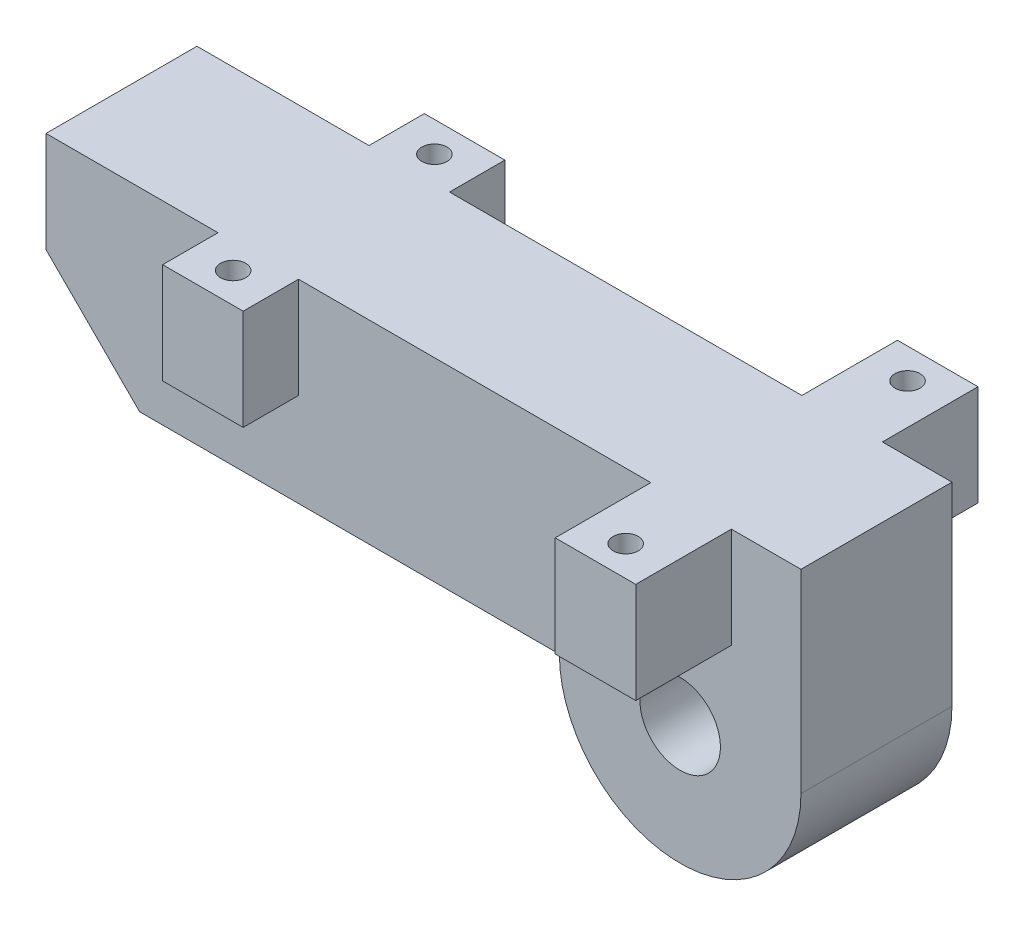
ISO-10303-21;
HEADER;
FILE_DESCRIPTION(('STEP AP214'),'2;1');
FILE_NAME('part.step','',(''),(''),'','','');
FILE_SCHEMA(('AUTOMOTIVE_DESIGN { 1 0 10303 214 1 1 1 1 }'));
ENDSEC;
DATA;
#1=APPLICATION_CONTEXT('core data for automotive mechanical design processes');
#2=APPLICATION_PROTOCOL_DEFINITION('international standard','automotive_design',2000,#1);
#3=PRODUCT_CONTEXT('',#1,'mechanical');
#4=PRODUCT('Part','Part','',(#3));
#5=PRODUCT_RELATED_PRODUCT_CATEGORY('part','',(#4));
#6=PRODUCT_DEFINITION_FORMATION('','',#4);
#7=PRODUCT_DEFINITION_CONTEXT('part definition',#1,'design');
#8=PRODUCT_DEFINITION('design','',#6,#7);
#9=PRODUCT_DEFINITION_SHAPE('','',#8);
#10=(LENGTH_UNIT() NAMED_UNIT(*) SI_UNIT(.MILLI.,.METRE.));
#11=(NAMED_UNIT(*) PLANE_ANGLE_UNIT() SI_UNIT($,.RADIAN.));
#12=(NAMED_UNIT(*) SI_UNIT($,.STERADIAN.) SOLID_ANGLE_UNIT());
#13=UNCERTAINTY_MEASURE_WITH_UNIT(LENGTH_MEASURE(1.E-05),#10,'distance_accuracy_value','');
#14=(GEOMETRIC_REPRESENTATION_CONTEXT(3) GLOBAL_UNCERTAINTY_ASSIGNED_CONTEXT((#13)) GLOBAL_UNIT_ASSIGNED_CONTEXT((#10,
#11,#12)) REPRESENTATION_CONTEXT('',''));
#15=CARTESIAN_POINT('',(0.,0.,0.));
#16=DIRECTION('',(0.,0.,1.));
#17=DIRECTION('',(1.,0.,0.));
#18=AXIS2_PLACEMENT_3D('',#15,#16,#17);
#19=CARTESIAN_POINT('',(0.,0.,0.));
#20=DIRECTION('',(0.,1.,0.));
#21=DIRECTION('',(0.,0.,1.));
#22=AXIS2_PLACEMENT_3D('',#19,#20,#21);
#23=PLANE('',#22);
#24=CARTESIAN_POINT('',(-16.4121202909197,0.,-10.));
#25=DIRECTION('',(0.,1.,0.));
#26=DIRECTION('',(0.,0.,1.));
#27=AXIS2_PLACEMENT_3D('',#24,#25,#26);
#28=CIRCLE('',#27,1.25);
#29=CARTESIAN_POINT('',(-16.4121202909197,0.,-8.75));
#30=VERTEX_POINT('',#29);
#31=EDGE_CURVE('E294',#30,#30,#28,.T.);
#32=ORIENTED_EDGE('',*,*,#31,.T.);
#33=EDGE_LOOP('',(#32));
#34=FACE_BOUND('',#33,.T.);
#35=DIRECTION('',(1.,0.,0.));
#36=VECTOR('',#35,1.);
#37=CARTESIAN_POINT('',(-37.5,0.,-7.50000000000002));
#38=LINE('',#37,#36);
#39=CARTESIAN_POINT('',(-20.4121202909197,0.,-7.50000000000002));
#40=VERTEX_POINT('',#39);
#41=CARTESIAN_POINT('',(-12.4121202909197,0.,-7.50000000000002));
#42=VERTEX_POINT('',#41);
#43=EDGE_CURVE('E11',#40,#42,#38,.T.);
#44=ORIENTED_EDGE('',*,*,#43,.F.);
#45=DIRECTION('',(0.,0.,1.));
#46=VECTOR('',#45,1.);
#47=CARTESIAN_POINT('',(-20.4121202909197,0.,-13.));
#48=LINE('',#47,#46);
#49=CARTESIAN_POINT('',(-20.4121202909197,0.,-13.));
#50=VERTEX_POINT('',#49);
#51=EDGE_CURVE('E174',#50,#40,#48,.T.);
#52=ORIENTED_EDGE('',*,*,#51,.F.);
#53=DIRECTION('',(-1.,0.,0.));
#54=VECTOR('',#53,1.);
#55=CARTESIAN_POINT('',(-20.4121202909197,0.,-13.));
#56=LINE('',#55,#54);
#57=CARTESIAN_POINT('',(-12.4121202909197,0.,-13.));
#58=VERTEX_POINT('',#57);
#59=EDGE_CURVE('E98',#58,#50,#56,.T.);
#60=ORIENTED_EDGE('',*,*,#59,.F.);
#61=DIRECTION('',(0.,0.,-1.));
#62=VECTOR('',#61,1.);
#63=CARTESIAN_POINT('',(-12.4121202909197,0.,-13.));
#64=LINE('',#63,#62);
#65=EDGE_CURVE('E91',#42,#58,#64,.T.);
#66=ORIENTED_EDGE('',*,*,#65,.F.);
#67=EDGE_LOOP('',(#44,#52,#60,#66));
#68=FACE_BOUND('',#67,.T.);
#69=ADVANCED_FACE('F39',(#34,#68),#23,.F.);
#70=CARTESIAN_POINT('',(26.5878797090803,0.,-14.));
#71=DIRECTION('',(0.,1.,0.));
#72=DIRECTION('',(0.,0.,1.));
#73=AXIS2_PLACEMENT_3D('',#70,#71,#72);
#74=CIRCLE('',#73,1.25);
#75=CARTESIAN_POINT('',(26.5878797090803,0.,-12.75));
#76=VERTEX_POINT('',#75);
#77=EDGE_CURVE('E306',#76,#76,#74,.T.);
#78=ORIENTED_EDGE('',*,*,#77,.T.);
#79=EDGE_LOOP('',(#78));
#80=FACE_BOUND('',#79,.T.);
#81=CARTESIAN_POINT('',(22.5878797090803,0.,-7.50000000000001));
#82=VERTEX_POINT('',#81);
#83=CARTESIAN_POINT('',(30.5878797090803,0.,-7.50000000000001));
#84=VERTEX_POINT('',#83);
#85=EDGE_CURVE('E49',#82,#84,#38,.T.);
#86=ORIENTED_EDGE('',*,*,#85,.F.);
#87=DIRECTION('',(0.,0.,1.));
#88=VECTOR('',#87,1.);
#89=CARTESIAN_POINT('',(22.5878797090803,0.,-17.));
#90=LINE('',#89,#88);
#91=CARTESIAN_POINT('',(22.5878797090803,0.,-17.));
#92=VERTEX_POINT('',#91);
#93=EDGE_CURVE('E207',#92,#82,#90,.T.);
#94=ORIENTED_EDGE('',*,*,#93,.F.);
#95=DIRECTION('',(-1.,0.,0.));
#96=VECTOR('',#95,1.);
#97=CARTESIAN_POINT('',(22.5878797090803,0.,-17.));
#98=LINE('',#97,#96);
#99=CARTESIAN_POINT('',(30.5878797090803,0.,-17.));
#100=VERTEX_POINT('',#99);
#101=EDGE_CURVE('E205',#100,#92,#98,.T.);
#102=ORIENTED_EDGE('',*,*,#101,.F.);
#103=DIRECTION('',(0.,0.,-1.));
#104=VECTOR('',#103,1.);
#105=CARTESIAN_POINT('',(30.5878797090803,0.,-17.));
#106=LINE('',#105,#104);
#107=EDGE_CURVE('E203',#84,#100,#106,.T.);
#108=ORIENTED_EDGE('',*,*,#107,.F.);
#109=EDGE_LOOP('',(#86,#94,#102,#108));
#110=FACE_BOUND('',#109,.T.);
#111=ADVANCED_FACE('F388',(#80,#110),#23,.F.);
#112=CARTESIAN_POINT('',(26.5878797090803,0.,14.));
#113=DIRECTION('',(0.,1.,0.));
#114=DIRECTION('',(0.,0.,1.));
#115=AXIS2_PLACEMENT_3D('',#112,#113,#114);
#116=CIRCLE('',#115,1.25);
#117=CARTESIAN_POINT('',(26.5878797090803,0.,15.25));
#118=VERTEX_POINT('',#117);
#119=EDGE_CURVE('E191',#118,#118,#116,.T.);
#120=ORIENTED_EDGE('',*,*,#119,.T.);
#121=EDGE_LOOP('',(#120));
#122=FACE_BOUND('',#121,.T.);
#123=DIRECTION('',(-1.,0.,0.));
#124=VECTOR('',#123,1.);
#125=CARTESIAN_POINT('',(-37.5,0.,7.49999999999997));
#126=LINE('',#125,#124);
#127=CARTESIAN_POINT('',(30.5878797090803,0.,7.49999999999997));
#128=VERTEX_POINT('',#127);
#129=CARTESIAN_POINT('',(22.5878797090803,0.,7.49999999999997));
#130=VERTEX_POINT('',#129);
#131=EDGE_CURVE('E267',#128,#130,#126,.T.);
#132=ORIENTED_EDGE('',*,*,#131,.F.);
#133=DIRECTION('',(0.,0.,-1.));
#134=VECTOR('',#133,1.);
#135=CARTESIAN_POINT('',(30.5878797090803,0.,7.49999999999999));
#136=LINE('',#135,#134);
#137=CARTESIAN_POINT('',(30.5878797090803,0.,17.));
#138=VERTEX_POINT('',#137);
#139=EDGE_CURVE('E200',#138,#128,#136,.T.);
#140=ORIENTED_EDGE('',*,*,#139,.F.);
#141=DIRECTION('',(1.,0.,0.));
#142=VECTOR('',#141,1.);
#143=CARTESIAN_POINT('',(22.5878797090803,0.,17.));
#144=LINE('',#143,#142);
#145=CARTESIAN_POINT('',(22.5878797090803,0.,17.));
#146=VERTEX_POINT('',#145);
#147=EDGE_CURVE('E198',#146,#138,#144,.T.);
#148=ORIENTED_EDGE('',*,*,#147,.F.);
#149=DIRECTION('',(0.,0.,1.));
#150=VECTOR('',#149,1.);
#151=CARTESIAN_POINT('',(22.5878797090803,0.,7.49999999999999));
#152=LINE('',#151,#150);
#153=EDGE_CURVE('E196',#130,#146,#152,.T.);
#154=ORIENTED_EDGE('',*,*,#153,.F.);
#155=EDGE_LOOP('',(#132,#140,#148,#154));
#156=FACE_BOUND('',#155,.T.);
#157=ADVANCED_FACE('F394',(#122,#156),#23,.F.);
#158=CARTESIAN_POINT('',(-16.4121202909197,0.,10.));
#159=DIRECTION('',(0.,1.,0.));
#160=DIRECTION('',(0.,0.,1.));
#161=AXIS2_PLACEMENT_3D('',#158,#159,#160);
#162=CIRCLE('',#161,1.25);
#163=CARTESIAN_POINT('',(-16.4121202909197,0.,11.25));
#164=VERTEX_POINT('',#163);
#165=EDGE_CURVE('E300',#164,#164,#162,.T.);
#166=ORIENTED_EDGE('',*,*,#165,.T.);
#167=EDGE_LOOP('',(#166));
#168=FACE_BOUND('',#167,.T.);
#169=CARTESIAN_POINT('',(-12.4121202909197,0.,7.49999999999997));
#170=VERTEX_POINT('',#169);
#171=CARTESIAN_POINT('',(-20.4121202909197,0.,7.49999999999999));
#172=VERTEX_POINT('',#171);
#173=EDGE_CURVE('E265',#170,#172,#126,.T.);
#174=ORIENTED_EDGE('',*,*,#173,.F.);
#175=DIRECTION('',(0.,0.,-1.));
#176=VECTOR('',#175,1.);
#177=CARTESIAN_POINT('',(-12.4121202909197,0.,7.49999999999999));
#178=LINE('',#177,#176);
#179=CARTESIAN_POINT('',(-12.4121202909197,0.,13.));
#180=VERTEX_POINT('',#179);
#181=EDGE_CURVE('E193',#180,#170,#178,.T.);
#182=ORIENTED_EDGE('',*,*,#181,.F.);
#183=DIRECTION('',(1.,0.,0.));
#184=VECTOR('',#183,1.);
#185=CARTESIAN_POINT('',(-20.4121202909197,0.,13.));
#186=LINE('',#185,#184);
#187=CARTESIAN_POINT('',(-20.4121202909197,0.,13.));
#188=VERTEX_POINT('',#187);
#189=EDGE_CURVE('E190',#188,#180,#186,.T.);
#190=ORIENTED_EDGE('',*,*,#189,.F.);
#191=DIRECTION('',(0.,0.,1.));
#192=VECTOR('',#191,1.);
#193=CARTESIAN_POINT('',(-20.4121202909197,0.,7.49999999999999));
#194=LINE('',#193,#192);
#195=EDGE_CURVE('E188',#172,#188,#194,.T.);
#196=ORIENTED_EDGE('',*,*,#195,.F.);
#197=EDGE_LOOP('',(#174,#182,#190,#196));
#198=FACE_BOUND('',#197,.T.);
#199=ADVANCED_FACE('F368',(#168,#198),#23,.F.);
#200=CARTESIAN_POINT('',(-20.4121202909197,10.,7.49999999999999));
#201=DIRECTION('',(1.,0.,0.));
#202=DIRECTION('',(0.,0.,-1.));
#203=AXIS2_PLACEMENT_3D('',#200,#201,#202);
#204=PLANE('',#203);
#205=ORIENTED_EDGE('',*,*,#195,.T.);
#206=DIRECTION('',(0.,-1.,0.));
#207=VECTOR('',#206,1.);
#208=CARTESIAN_POINT('',(-20.4121202909197,10.,13.));
#209=LINE('',#208,#207);
#210=CARTESIAN_POINT('',(-20.4121202909197,10.,13.));
#211=VERTEX_POINT('',#210);
#212=EDGE_CURVE('E260',#211,#188,#209,.T.);
#213=ORIENTED_EDGE('',*,*,#212,.F.);
#214=DIRECTION('',(0.,0.,1.));
#215=VECTOR('',#214,1.);
#216=CARTESIAN_POINT('',(-20.4121202909197,10.,7.49999999999999));
#217=LINE('',#216,#215);
#218=CARTESIAN_POINT('',(-20.4121202909197,10.,7.49999999999999));
#219=VERTEX_POINT('',#218);
#220=EDGE_CURVE('E107',#219,#211,#217,.T.);
#221=ORIENTED_EDGE('',*,*,#220,.F.);
#222=DIRECTION('',(0.,-1.,0.));
#223=VECTOR('',#222,1.);
#224=CARTESIAN_POINT('',(-20.4121202909197,10.,7.49999999999999));
#225=LINE('',#224,#223);
#226=EDGE_CURVE('E43',#219,#172,#225,.T.);
#227=ORIENTED_EDGE('',*,*,#226,.T.);
#228=EDGE_LOOP('',(#205,#213,#221,#227));
#229=FACE_BOUND('',#228,.T.);
#230=ADVANCED_FACE('F41',(#229),#204,.F.);
#231=CARTESIAN_POINT('',(-20.4121202909197,10.,13.));
#232=DIRECTION('',(0.,0.,-1.));
#233=DIRECTION('',(-1.,0.,0.));
#234=AXIS2_PLACEMENT_3D('',#231,#232,#233);
#235=PLANE('',#234);
#236=ORIENTED_EDGE('',*,*,#189,.T.);
#237=DIRECTION('',(0.,-1.,0.));
#238=VECTOR('',#237,1.);
#239=CARTESIAN_POINT('',(-12.4121202909197,10.,13.));
#240=LINE('',#239,#238);
#241=CARTESIAN_POINT('',(-12.4121202909197,10.,13.));
#242=VERTEX_POINT('',#241);
#243=EDGE_CURVE('E258',#242,#180,#240,.T.);
#244=ORIENTED_EDGE('',*,*,#243,.F.);
#245=DIRECTION('',(1.,0.,0.));
#246=VECTOR('',#245,1.);
#247=CARTESIAN_POINT('',(-20.4121202909197,10.,13.));
#248=LINE('',#247,#246);
#249=EDGE_CURVE('E316',#211,#242,#248,.T.);
#250=ORIENTED_EDGE('',*,*,#249,.F.);
#251=ORIENTED_EDGE('',*,*,#212,.T.);
#252=EDGE_LOOP('',(#236,#244,#250,#251));
#253=FACE_BOUND('',#252,.T.);
#254=ADVANCED_FACE('F379',(#253),#235,.F.);
#255=CARTESIAN_POINT('',(-12.4121202909197,10.,7.49999999999999));
#256=DIRECTION('',(-1.,0.,0.));
#257=DIRECTION('',(0.,0.,1.));
#258=AXIS2_PLACEMENT_3D('',#255,#256,#257);
#259=PLANE('',#258);
#260=ORIENTED_EDGE('',*,*,#181,.T.);
#261=DIRECTION('',(0.,-1.,0.));
#262=VECTOR('',#261,1.);
#263=CARTESIAN_POINT('',(-12.4121202909197,10.,7.49999999999999));
#264=LINE('',#263,#262);
#265=CARTESIAN_POINT('',(-12.4121202909197,10.,7.49999999999999));
#266=VERTEX_POINT('',#265);
#267=EDGE_CURVE('E255',#266,#170,#264,.T.);
#268=ORIENTED_EDGE('',*,*,#267,.F.);
#269=DIRECTION('',(0.,0.,-1.));
#270=VECTOR('',#269,1.);
#271=CARTESIAN_POINT('',(-12.4121202909197,10.,7.49999999999999));
#272=LINE('',#271,#270);
#273=EDGE_CURVE('E318',#242,#266,#272,.T.);
#274=ORIENTED_EDGE('',*,*,#273,.F.);
#275=ORIENTED_EDGE('',*,*,#243,.T.);
#276=EDGE_LOOP('',(#260,#268,#274,#275));
#277=FACE_BOUND('',#276,.T.);
#278=ADVANCED_FACE('F371',(#277),#259,.F.);
#279=CARTESIAN_POINT('',(22.5878797090803,10.,7.49999999999999));
#280=DIRECTION('',(1.,0.,0.));
#281=DIRECTION('',(0.,0.,-1.));
#282=AXIS2_PLACEMENT_3D('',#279,#280,#281);
#283=PLANE('',#282);
#284=ORIENTED_EDGE('',*,*,#153,.T.);
#285=DIRECTION('',(0.,-1.,0.));
#286=VECTOR('',#285,1.);
#287=CARTESIAN_POINT('',(22.5878797090803,10.,17.));
#288=LINE('',#287,#286);
#289=CARTESIAN_POINT('',(22.5878797090803,10.,17.));
#290=VERTEX_POINT('',#289);
#291=EDGE_CURVE('E249',#290,#146,#288,.T.);
#292=ORIENTED_EDGE('',*,*,#291,.F.);
#293=DIRECTION('',(0.,0.,1.));
#294=VECTOR('',#293,1.);
#295=CARTESIAN_POINT('',(22.5878797090803,10.,7.49999999999999));
#296=LINE('',#295,#294);
#297=CARTESIAN_POINT('',(22.5878797090803,10.,7.49999999999999));
#298=VERTEX_POINT('',#297);
#299=EDGE_CURVE('E322',#298,#290,#296,.T.);
#300=ORIENTED_EDGE('',*,*,#299,.F.);
#301=DIRECTION('',(0.,-1.,0.));
#302=VECTOR('',#301,1.);
#303=CARTESIAN_POINT('',(22.5878797090803,10.,7.49999999999999));
#304=LINE('',#303,#302);
#305=EDGE_CURVE('E252',#298,#130,#304,.T.);
#306=ORIENTED_EDGE('',*,*,#305,.T.);
#307=EDGE_LOOP('',(#284,#292,#300,#306));
#308=FACE_BOUND('',#307,.T.);
#309=ADVANCED_FACE('F385',(#308),#283,.F.);
#310=CARTESIAN_POINT('',(22.5878797090803,10.,17.));
#311=DIRECTION('',(0.,0.,-1.));
#312=DIRECTION('',(-1.,0.,0.));
#313=AXIS2_PLACEMENT_3D('',#310,#311,#312);
#314=PLANE('',#313);
#315=ORIENTED_EDGE('',*,*,#147,.T.);
#316=DIRECTION('',(0.,-1.,0.));
#317=VECTOR('',#316,1.);
#318=CARTESIAN_POINT('',(30.5878797090803,10.,17.));
#319=LINE('',#318,#317);
#320=CARTESIAN_POINT('',(30.5878797090803,10.,17.));
#321=VERTEX_POINT('',#320);
#322=EDGE_CURVE('E246',#321,#138,#319,.T.);
#323=ORIENTED_EDGE('',*,*,#322,.F.);
#324=DIRECTION('',(1.,0.,0.));
#325=VECTOR('',#324,1.);
#326=CARTESIAN_POINT('',(22.5878797090803,10.,17.));
#327=LINE('',#326,#325);
#328=EDGE_CURVE('E324',#290,#321,#327,.T.);
#329=ORIENTED_EDGE('',*,*,#328,.F.);
#330=ORIENTED_EDGE('',*,*,#291,.T.);
#331=EDGE_LOOP('',(#315,#323,#329,#330));
#332=FACE_BOUND('',#331,.T.);
#333=ADVANCED_FACE('F532',(#332),#314,.F.);
#334=CARTESIAN_POINT('',(30.5878797090803,10.,7.49999999999999));
#335=DIRECTION('',(-1.,0.,0.));
#336=DIRECTION('',(0.,0.,1.));
#337=AXIS2_PLACEMENT_3D('',#334,#335,#336);
#338=PLANE('',#337);
#339=ORIENTED_EDGE('',*,*,#139,.T.);
#340=DIRECTION('',(0.,-1.,0.));
#341=VECTOR('',#340,1.);
#342=CARTESIAN_POINT('',(30.5878797090803,10.,7.49999999999999));
#343=LINE('',#342,#341);
#344=CARTESIAN_POINT('',(30.5878797090803,10.,7.49999999999999));
#345=VERTEX_POINT('',#344);
#346=EDGE_CURVE('E243',#345,#128,#343,.T.);
#347=ORIENTED_EDGE('',*,*,#346,.F.);
#348=DIRECTION('',(0.,0.,-1.));
#349=VECTOR('',#348,1.);
#350=CARTESIAN_POINT('',(30.5878797090803,10.,7.49999999999999));
#351=LINE('',#350,#349);
#352=EDGE_CURVE('E326',#321,#345,#351,.T.);
#353=ORIENTED_EDGE('',*,*,#352,.F.);
#354=ORIENTED_EDGE('',*,*,#322,.T.);
#355=EDGE_LOOP('',(#339,#347,#353,#354));
#356=FACE_BOUND('',#355,.T.);
#357=ADVANCED_FACE('F529',(#356),#338,.F.);
#358=CARTESIAN_POINT('',(37.5,10.,7.49999999999999));
#359=DIRECTION('',(0.,0.,-1.));
#360=DIRECTION('',(-1.,0.,0.));
#361=AXIS2_PLACEMENT_3D('',#358,#359,#360);
#362=PLANE('',#361);
#363=ORIENTED_EDGE('',*,*,#346,.T.);
#364=ORIENTED_EDGE('',*,*,#131,.T.);
#365=ORIENTED_EDGE('',*,*,#305,.F.);
#366=DIRECTION('',(1.,0.,0.));
#367=VECTOR('',#366,1.);
#368=CARTESIAN_POINT('',(22.5878797090803,10.,7.49999999999999));
#369=LINE('',#368,#367);
#370=EDGE_CURVE('E320',#266,#298,#369,.T.);
#371=ORIENTED_EDGE('',*,*,#370,.F.);
#372=ORIENTED_EDGE('',*,*,#267,.T.);
#373=ORIENTED_EDGE('',*,*,#173,.T.);
#374=ORIENTED_EDGE('',*,*,#226,.F.);
#375=DIRECTION('',(1.,0.,0.));
#376=VECTOR('',#375,1.);
#377=CARTESIAN_POINT('',(-20.4121202909197,10.,7.49999999999999));
#378=LINE('',#377,#376);
#379=CARTESIAN_POINT('',(-37.5,10.,7.5));
#380=VERTEX_POINT('',#379);
#381=EDGE_CURVE('E216',#380,#219,#378,.T.);
#382=ORIENTED_EDGE('',*,*,#381,.F.);
#383=DIRECTION('',(0.,-1.,0.));
#384=VECTOR('',#383,1.);
#385=CARTESIAN_POINT('',(-37.5,10.,7.5));
#386=LINE('',#385,#384);
#387=CARTESIAN_POINT('',(-37.5,0.,7.49999999999997));
#388=VERTEX_POINT('',#387);
#389=EDGE_CURVE('E184',#380,#388,#386,.T.);
#390=ORIENTED_EDGE('',*,*,#389,.T.);
#391=DIRECTION('',(0.707106781186556,-0.707106781186539,0.));
#392=VECTOR('',#391,1.);
#393=CARTESIAN_POINT('',(-37.5,0.,7.49999999999997));
#394=LINE('',#393,#392);
#395=CARTESIAN_POINT('',(-28.2015236206531,-9.2984763793467,7.49999999999997));
#396=VERTEX_POINT('',#395);
#397=EDGE_CURVE('E458',#388,#396,#394,.T.);
#398=ORIENTED_EDGE('',*,*,#397,.T.);
#399=DIRECTION('',(1.,0.,0.));
#400=VECTOR('',#399,1.);
#401=CARTESIAN_POINT('',(-28.2015236206531,-9.2984763793467,7.49999999999997));
#402=LINE('',#401,#400);
#403=CARTESIAN_POINT('',(13.5,-9.29847637934681,7.49999999999997));
#404=VERTEX_POINT('',#403);
#405=EDGE_CURVE('E461',#396,#404,#402,.T.);
#406=ORIENTED_EDGE('',*,*,#405,.T.);
#407=CARTESIAN_POINT('',(25.5,-9.29847637934681,7.49999999999997));
#408=DIRECTION('',(0.,0.,1.));
#409=DIRECTION('',(1.,0.,0.));
#410=AXIS2_PLACEMENT_3D('',#407,#408,#409);
#411=CIRCLE('',#410,12.);
#412=CARTESIAN_POINT('',(37.5,-9.29847637934682,7.49999999999997));
#413=VERTEX_POINT('',#412);
#414=EDGE_CURVE('E275',#404,#413,#411,.T.);
#415=ORIENTED_EDGE('',*,*,#414,.T.);
#416=DIRECTION('',(0.,-1.,0.));
#417=VECTOR('',#416,1.);
#418=CARTESIAN_POINT('',(37.5,10.,7.49999999999999));
#419=LINE('',#418,#417);
#420=CARTESIAN_POINT('',(37.5,10.,7.49999999999999));
#421=VERTEX_POINT('',#420);
#422=EDGE_CURVE('E240',#421,#413,#419,.T.);
#423=ORIENTED_EDGE('',*,*,#422,.F.);
#424=DIRECTION('',(1.,0.,0.));
#425=VECTOR('',#424,1.);
#426=CARTESIAN_POINT('',(37.5,10.,7.49999999999999));
#427=LINE('',#426,#425);
#428=EDGE_CURVE('E328',#345,#421,#427,.T.);
#429=ORIENTED_EDGE('',*,*,#428,.F.);
#430=EDGE_LOOP('',(#363,#364,#365,#371,#372,#373,#374,#382,#390,#398,#406,#415,#423,#429));
#431=FACE_BOUND('',#430,.T.);
#432=CARTESIAN_POINT('',(25.5,-9.29847637934681,7.49999999999997));
#433=DIRECTION('',(0.,0.,1.));
#434=DIRECTION('',(1.,0.,0.));
#435=AXIS2_PLACEMENT_3D('',#432,#433,#434);
#436=CIRCLE('',#435,4.);
#437=CARTESIAN_POINT('',(29.5,-9.29847637934681,7.49999999999997));
#438=VERTEX_POINT('',#437);
#439=EDGE_CURVE('E457',#438,#438,#436,.T.);
#440=ORIENTED_EDGE('',*,*,#439,.F.);
#441=EDGE_LOOP('',(#440));
#442=FACE_BOUND('',#441,.T.);
#443=ADVANCED_FACE('F375',(#431,#442),#362,.F.);
#444=CARTESIAN_POINT('',(37.5,10.,-7.50000000000001));
#445=DIRECTION('',(-1.,0.,0.));
#446=DIRECTION('',(0.,0.,1.));
#447=AXIS2_PLACEMENT_3D('',#444,#445,#446);
#448=PLANE('',#447);
#449=ORIENTED_EDGE('',*,*,#422,.T.);
#450=DIRECTION('',(0.,0.,1.));
#451=VECTOR('',#450,1.);
#452=CARTESIAN_POINT('',(37.5,-9.29847637934682,-85.4655378746379));
#453=LINE('',#452,#451);
#454=CARTESIAN_POINT('',(37.5,-9.29847637934681,-7.50000000000001));
#455=VERTEX_POINT('',#454);
#456=EDGE_CURVE('E277',#455,#413,#453,.T.);
#457=ORIENTED_EDGE('',*,*,#456,.F.);
#458=DIRECTION('',(0.,-1.,0.));
#459=VECTOR('',#458,1.);
#460=CARTESIAN_POINT('',(37.5,10.,-7.50000000000001));
#461=LINE('',#460,#459);
#462=CARTESIAN_POINT('',(37.5,10.,-7.50000000000001));
#463=VERTEX_POINT('',#462);
#464=EDGE_CURVE('E237',#463,#455,#461,.T.);
#465=ORIENTED_EDGE('',*,*,#464,.F.);
#466=DIRECTION('',(0.,0.,-1.));
#467=VECTOR('',#466,1.);
#468=CARTESIAN_POINT('',(37.5,10.,-7.50000000000001));
#469=LINE('',#468,#467);
#470=EDGE_CURVE('E330',#421,#463,#469,.T.);
#471=ORIENTED_EDGE('',*,*,#470,.F.);
#472=EDGE_LOOP('',(#449,#457,#465,#471));
#473=FACE_BOUND('',#472,.T.);
#474=ADVANCED_FACE('F522',(#473),#448,.F.);
#475=CARTESIAN_POINT('',(30.5878797090803,10.,-17.));
#476=DIRECTION('',(-1.,0.,0.));
#477=DIRECTION('',(0.,0.,1.));
#478=AXIS2_PLACEMENT_3D('',#475,#476,#477);
#479=PLANE('',#478);
#480=ORIENTED_EDGE('',*,*,#107,.T.);
#481=DIRECTION('',(0.,-1.,0.));
#482=VECTOR('',#481,1.);
#483=CARTESIAN_POINT('',(30.5878797090803,10.,-17.));
#484=LINE('',#483,#482);
#485=CARTESIAN_POINT('',(30.5878797090803,10.,-17.));
#486=VERTEX_POINT('',#485);
#487=EDGE_CURVE('E231',#486,#100,#484,.T.);
#488=ORIENTED_EDGE('',*,*,#487,.F.);
#489=DIRECTION('',(0.,0.,-1.));
#490=VECTOR('',#489,1.);
#491=CARTESIAN_POINT('',(30.5878797090803,10.,-17.));
#492=LINE('',#491,#490);
#493=CARTESIAN_POINT('',(30.5878797090803,10.,-7.50000000000001));
#494=VERTEX_POINT('',#493);
#495=EDGE_CURVE('E334',#494,#486,#492,.T.);
#496=ORIENTED_EDGE('',*,*,#495,.F.);
#497=DIRECTION('',(0.,-1.,0.));
#498=VECTOR('',#497,1.);
#499=CARTESIAN_POINT('',(30.5878797090803,10.,-7.50000000000001));
#500=LINE('',#499,#498);
#501=EDGE_CURVE('E234',#494,#84,#500,.T.);
#502=ORIENTED_EDGE('',*,*,#501,.T.);
#503=EDGE_LOOP('',(#480,#488,#496,#502));
#504=FACE_BOUND('',#503,.T.);
#505=ADVANCED_FACE('F518',(#504),#479,.F.);
#506=CARTESIAN_POINT('',(22.5878797090803,10.,-17.));
#507=DIRECTION('',(0.,0.,1.));
#508=DIRECTION('',(1.,0.,0.));
#509=AXIS2_PLACEMENT_3D('',#506,#507,#508);
#510=PLANE('',#509);
#511=ORIENTED_EDGE('',*,*,#101,.T.);
#512=DIRECTION('',(0.,-1.,0.));
#513=VECTOR('',#512,1.);
#514=CARTESIAN_POINT('',(22.5878797090803,10.,-17.));
#515=LINE('',#514,#513);
#516=CARTESIAN_POINT('',(22.5878797090803,10.,-17.));
#517=VERTEX_POINT('',#516);
#518=EDGE_CURVE('E228',#517,#92,#515,.T.);
#519=ORIENTED_EDGE('',*,*,#518,.F.);
#520=DIRECTION('',(-1.,0.,0.));
#521=VECTOR('',#520,1.);
#522=CARTESIAN_POINT('',(22.5878797090803,10.,-17.));
#523=LINE('',#522,#521);
#524=EDGE_CURVE('E336',#486,#517,#523,.T.);
#525=ORIENTED_EDGE('',*,*,#524,.F.);
#526=ORIENTED_EDGE('',*,*,#487,.T.);
#527=EDGE_LOOP('',(#511,#519,#525,#526));
#528=FACE_BOUND('',#527,.T.);
#529=ADVANCED_FACE('F514',(#528),#510,.F.);
#530=CARTESIAN_POINT('',(22.5878797090803,10.,-17.));
#531=DIRECTION('',(1.,0.,0.));
#532=DIRECTION('',(0.,0.,-1.));
#533=AXIS2_PLACEMENT_3D('',#530,#531,#532);
#534=PLANE('',#533);
#535=ORIENTED_EDGE('',*,*,#93,.T.);
#536=DIRECTION('',(0.,-1.,0.));
#537=VECTOR('',#536,1.);
#538=CARTESIAN_POINT('',(22.5878797090803,10.,-7.5));
#539=LINE('',#538,#537);
#540=CARTESIAN_POINT('',(22.5878797090803,10.,-7.5));
#541=VERTEX_POINT('',#540);
#542=EDGE_CURVE('E225',#541,#82,#539,.T.);
#543=ORIENTED_EDGE('',*,*,#542,.F.);
#544=DIRECTION('',(0.,0.,1.));
#545=VECTOR('',#544,1.);
#546=CARTESIAN_POINT('',(22.5878797090803,10.,-17.));
#547=LINE('',#546,#545);
#548=EDGE_CURVE('E338',#517,#541,#547,.T.);
#549=ORIENTED_EDGE('',*,*,#548,.F.);
#550=ORIENTED_EDGE('',*,*,#518,.T.);
#551=EDGE_LOOP('',(#535,#543,#549,#550));
#552=FACE_BOUND('',#551,.T.);
#553=ADVANCED_FACE('F511',(#552),#534,.F.);
#554=CARTESIAN_POINT('',(-12.4121202909197,10.,-13.));
#555=DIRECTION('',(-1.,0.,0.));
#556=DIRECTION('',(0.,0.,1.));
#557=AXIS2_PLACEMENT_3D('',#554,#555,#556);
#558=PLANE('',#557);
#559=ORIENTED_EDGE('',*,*,#65,.T.);
#560=DIRECTION('',(0.,-1.,0.));
#561=VECTOR('',#560,1.);
#562=CARTESIAN_POINT('',(-12.4121202909197,10.,-13.));
#563=LINE('',#562,#561);
#564=CARTESIAN_POINT('',(-12.4121202909197,10.,-13.));
#565=VERTEX_POINT('',#564);
#566=EDGE_CURVE('E221',#565,#58,#563,.T.);
#567=ORIENTED_EDGE('',*,*,#566,.F.);
#568=DIRECTION('',(0.,0.,-1.));
#569=VECTOR('',#568,1.);
#570=CARTESIAN_POINT('',(-12.4121202909197,10.,-13.));
#571=LINE('',#570,#569);
#572=CARTESIAN_POINT('',(-12.4121202909197,10.,-7.49999999999999));
#573=VERTEX_POINT('',#572);
#574=EDGE_CURVE('E342',#573,#565,#571,.T.);
#575=ORIENTED_EDGE('',*,*,#574,.F.);
#576=DIRECTION('',(0.,-1.,0.));
#577=VECTOR('',#576,1.);
#578=CARTESIAN_POINT('',(-12.4121202909197,10.,-7.49999999999999));
#579=LINE('',#578,#577);
#580=EDGE_CURVE('E223',#573,#42,#579,.T.);
#581=ORIENTED_EDGE('',*,*,#580,.T.);
#582=EDGE_LOOP('',(#559,#567,#575,#581));
#583=FACE_BOUND('',#582,.T.);
#584=ADVANCED_FACE('F346',(#583),#558,.F.);
#585=CARTESIAN_POINT('',(-20.4121202909197,10.,-13.));
#586=DIRECTION('',(0.,0.,1.));
#587=DIRECTION('',(1.,0.,0.));
#588=AXIS2_PLACEMENT_3D('',#585,#586,#587);
#589=PLANE('',#588);
#590=ORIENTED_EDGE('',*,*,#59,.T.);
#591=DIRECTION('',(0.,-1.,0.));
#592=VECTOR('',#591,1.);
#593=CARTESIAN_POINT('',(-20.4121202909197,10.,-13.));
#594=LINE('',#593,#592);
#595=CARTESIAN_POINT('',(-20.4121202909197,10.,-13.));
#596=VERTEX_POINT('',#595);
#597=EDGE_CURVE('E176',#596,#50,#594,.T.);
#598=ORIENTED_EDGE('',*,*,#597,.F.);
#599=DIRECTION('',(-1.,0.,0.));
#600=VECTOR('',#599,1.);
#601=CARTESIAN_POINT('',(-20.4121202909197,10.,-13.));
#602=LINE('',#601,#600);
#603=EDGE_CURVE('E165',#565,#596,#602,.T.);
#604=ORIENTED_EDGE('',*,*,#603,.F.);
#605=ORIENTED_EDGE('',*,*,#566,.T.);
#606=EDGE_LOOP('',(#590,#598,#604,#605));
#607=FACE_BOUND('',#606,.T.);
#608=ADVANCED_FACE('F347',(#607),#589,.F.);
#609=CARTESIAN_POINT('',(-20.4121202909197,10.,-13.));
#610=DIRECTION('',(1.,0.,0.));
#611=DIRECTION('',(0.,0.,-1.));
#612=AXIS2_PLACEMENT_3D('',#609,#610,#611);
#613=PLANE('',#612);
#614=ORIENTED_EDGE('',*,*,#51,.T.);
#615=DIRECTION('',(0.,-1.,0.));
#616=VECTOR('',#615,1.);
#617=CARTESIAN_POINT('',(-20.4121202909197,10.,-7.49999999999999));
#618=LINE('',#617,#616);
#619=CARTESIAN_POINT('',(-20.4121202909197,10.,-7.49999999999999));
#620=VERTEX_POINT('',#619);
#621=EDGE_CURVE('E170',#620,#40,#618,.T.);
#622=ORIENTED_EDGE('',*,*,#621,.F.);
#623=DIRECTION('',(0.,0.,1.));
#624=VECTOR('',#623,1.);
#625=CARTESIAN_POINT('',(-20.4121202909197,10.,-13.));
#626=LINE('',#625,#624);
#627=EDGE_CURVE('E158',#596,#620,#626,.T.);
#628=ORIENTED_EDGE('',*,*,#627,.F.);
#629=ORIENTED_EDGE('',*,*,#597,.T.);
#630=EDGE_LOOP('',(#614,#622,#628,#629));
#631=FACE_BOUND('',#630,.T.);
#632=ADVANCED_FACE('F171',(#631),#613,.F.);
#633=CARTESIAN_POINT('',(-20.4121202909197,10.,-7.49999999999999));
#634=DIRECTION('',(0.,0.,1.));
#635=DIRECTION('',(1.,0.,0.));
#636=AXIS2_PLACEMENT_3D('',#633,#634,#635);
#637=PLANE('',#636);
#638=ORIENTED_EDGE('',*,*,#621,.T.);
#639=ORIENTED_EDGE('',*,*,#43,.T.);
#640=ORIENTED_EDGE('',*,*,#580,.F.);
#641=DIRECTION('',(-1.,0.,0.));
#642=VECTOR('',#641,1.);
#643=CARTESIAN_POINT('',(22.5878797090803,10.,-7.5));
#644=LINE('',#643,#642);
#645=EDGE_CURVE('E340',#541,#573,#644,.T.);
#646=ORIENTED_EDGE('',*,*,#645,.F.);
#647=ORIENTED_EDGE('',*,*,#542,.T.);
#648=ORIENTED_EDGE('',*,*,#85,.T.);
#649=ORIENTED_EDGE('',*,*,#501,.F.);
#650=DIRECTION('',(-1.,0.,0.));
#651=VECTOR('',#650,1.);
#652=CARTESIAN_POINT('',(37.5,10.,-7.50000000000001));
#653=LINE('',#652,#651);
#654=EDGE_CURVE('E332',#463,#494,#653,.T.);
#655=ORIENTED_EDGE('',*,*,#654,.F.);
#656=ORIENTED_EDGE('',*,*,#464,.T.);
#657=CARTESIAN_POINT('',(25.5,-9.29847637934681,-7.50000000000001));
#658=DIRECTION('',(0.,0.,1.));
#659=DIRECTION('',(1.,0.,0.));
#660=AXIS2_PLACEMENT_3D('',#657,#658,#659);
#661=CIRCLE('',#660,12.);
#662=CARTESIAN_POINT('',(13.5,-9.29847637934681,-7.50000000000002));
#663=VERTEX_POINT('',#662);
#664=EDGE_CURVE('E280',#455,#663,#661,.F.);
#665=ORIENTED_EDGE('',*,*,#664,.T.);
#666=DIRECTION('',(-1.,0.,0.));
#667=VECTOR('',#666,1.);
#668=CARTESIAN_POINT('',(-28.2015236206531,-9.2984763793467,-7.50000000000002));
#669=LINE('',#668,#667);
#670=CARTESIAN_POINT('',(-28.2015236206531,-9.2984763793467,-7.50000000000002));
#671=VERTEX_POINT('',#670);
#672=EDGE_CURVE('E291',#663,#671,#669,.T.);
#673=ORIENTED_EDGE('',*,*,#672,.T.);
#674=DIRECTION('',(-0.707106781186556,0.707106781186539,0.));
#675=VECTOR('',#674,1.);
#676=CARTESIAN_POINT('',(-37.5,0.,-7.50000000000002));
#677=LINE('',#676,#675);
#678=CARTESIAN_POINT('',(-37.5,0.,-7.50000000000002));
#679=VERTEX_POINT('',#678);
#680=EDGE_CURVE('E464',#671,#679,#677,.T.);
#681=ORIENTED_EDGE('',*,*,#680,.T.);
#682=DIRECTION('',(0.,-1.,0.));
#683=VECTOR('',#682,1.);
#684=CARTESIAN_POINT('',(-37.5,10.,-7.49999999999999));
#685=LINE('',#684,#683);
#686=CARTESIAN_POINT('',(-37.5,10.,-7.49999999999999));
#687=VERTEX_POINT('',#686);
#688=EDGE_CURVE('E177',#687,#679,#685,.T.);
#689=ORIENTED_EDGE('',*,*,#688,.F.);
#690=DIRECTION('',(-1.,0.,0.));
#691=VECTOR('',#690,1.);
#692=CARTESIAN_POINT('',(-20.4121202909197,10.,-7.49999999999999));
#693=LINE('',#692,#691);
#694=EDGE_CURVE('E162',#620,#687,#693,.T.);
#695=ORIENTED_EDGE('',*,*,#694,.F.);
#696=EDGE_LOOP('',(#638,#639,#640,#646,#647,#648,#649,#655,#656,#665,#673,#681,#689,#695));
#697=FACE_BOUND('',#696,.T.);
#698=CARTESIAN_POINT('',(25.5,-9.29847637934681,-7.50000000000001));
#699=DIRECTION('',(0.,0.,1.));
#700=DIRECTION('',(1.,0.,0.));
#701=AXIS2_PLACEMENT_3D('',#698,#699,#700);
#702=CIRCLE('',#701,4.);
#703=CARTESIAN_POINT('',(29.5,-9.29847637934681,-7.50000000000001));
#704=VERTEX_POINT('',#703);
#705=EDGE_CURVE('E287',#704,#704,#702,.F.);
#706=ORIENTED_EDGE('',*,*,#705,.F.);
#707=EDGE_LOOP('',(#706));
#708=FACE_BOUND('',#707,.T.);
#709=ADVANCED_FACE('F179',(#697,#708),#637,.F.);
#710=CARTESIAN_POINT('',(-37.5,10.,-7.49999999999999));
#711=DIRECTION('',(1.,0.,0.));
#712=DIRECTION('',(0.,0.,-1.));
#713=AXIS2_PLACEMENT_3D('',#710,#711,#712);
#714=PLANE('',#713);
#715=DIRECTION('',(0.,0.,1.));
#716=VECTOR('',#715,1.);
#717=CARTESIAN_POINT('',(-37.5,0.,-7.49999999999999));
#718=LINE('',#717,#716);
#719=EDGE_CURVE('E213',#679,#388,#718,.T.);
#720=ORIENTED_EDGE('',*,*,#719,.T.);
#721=ORIENTED_EDGE('',*,*,#389,.F.);
#722=DIRECTION('',(0.,0.,1.));
#723=VECTOR('',#722,1.);
#724=CARTESIAN_POINT('',(-37.5,10.,-7.49999999999999));
#725=LINE('',#724,#723);
#726=EDGE_CURVE('E58',#687,#380,#725,.T.);
#727=ORIENTED_EDGE('',*,*,#726,.F.);
#728=ORIENTED_EDGE('',*,*,#688,.T.);
#729=EDGE_LOOP('',(#720,#721,#727,#728));
#730=FACE_BOUND('',#729,.T.);
#731=ADVANCED_FACE('F417',(#730),#714,.F.);
#732=CARTESIAN_POINT('',(0.,10.,0.));
#733=DIRECTION('',(0.,1.,0.));
#734=DIRECTION('',(0.,0.,1.));
#735=AXIS2_PLACEMENT_3D('',#732,#733,#734);
#736=PLANE('',#735);
#737=CARTESIAN_POINT('',(-16.4121202909197,10.,-10.));
#738=DIRECTION('',(0.,1.,0.));
#739=DIRECTION('',(0.,0.,1.));
#740=AXIS2_PLACEMENT_3D('',#737,#738,#739);
#741=CIRCLE('',#740,1.25);
#742=CARTESIAN_POINT('',(-16.4121202909197,10.,-8.75));
#743=VERTEX_POINT('',#742);
#744=EDGE_CURVE('E290',#743,#743,#741,.T.);
#745=ORIENTED_EDGE('',*,*,#744,.F.);
#746=EDGE_LOOP('',(#745));
#747=FACE_BOUND('',#746,.T.);
#748=CARTESIAN_POINT('',(-16.4121202909197,10.,10.));
#749=DIRECTION('',(0.,1.,0.));
#750=DIRECTION('',(0.,0.,1.));
#751=AXIS2_PLACEMENT_3D('',#748,#749,#750);
#752=CIRCLE('',#751,1.25);
#753=CARTESIAN_POINT('',(-16.4121202909197,10.,11.25));
#754=VERTEX_POINT('',#753);
#755=EDGE_CURVE('E297',#754,#754,#752,.T.);
#756=ORIENTED_EDGE('',*,*,#755,.F.);
#757=EDGE_LOOP('',(#756));
#758=FACE_BOUND('',#757,.T.);
#759=CARTESIAN_POINT('',(26.5878797090803,10.,-14.));
#760=DIRECTION('',(0.,1.,0.));
#761=DIRECTION('',(0.,0.,1.));
#762=AXIS2_PLACEMENT_3D('',#759,#760,#761);
#763=CIRCLE('',#762,1.25);
#764=CARTESIAN_POINT('',(26.5878797090803,10.,-12.75));
#765=VERTEX_POINT('',#764);
#766=EDGE_CURVE('E303',#765,#765,#763,.T.);
#767=ORIENTED_EDGE('',*,*,#766,.F.);
#768=EDGE_LOOP('',(#767));
#769=FACE_BOUND('',#768,.T.);
#770=CARTESIAN_POINT('',(26.5878797090803,10.,14.));
#771=DIRECTION('',(0.,1.,0.));
#772=DIRECTION('',(0.,0.,1.));
#773=AXIS2_PLACEMENT_3D('',#770,#771,#772);
#774=CIRCLE('',#773,1.25);
#775=CARTESIAN_POINT('',(26.5878797090803,10.,15.25));
#776=VERTEX_POINT('',#775);
#777=EDGE_CURVE('E309',#776,#776,#774,.T.);
#778=ORIENTED_EDGE('',*,*,#777,.F.);
#779=EDGE_LOOP('',(#778));
#780=FACE_BOUND('',#779,.T.);
#781=ORIENTED_EDGE('',*,*,#381,.T.);
#782=ORIENTED_EDGE('',*,*,#220,.T.);
#783=ORIENTED_EDGE('',*,*,#249,.T.);
#784=ORIENTED_EDGE('',*,*,#273,.T.);
#785=ORIENTED_EDGE('',*,*,#370,.T.);
#786=ORIENTED_EDGE('',*,*,#299,.T.);
#787=ORIENTED_EDGE('',*,*,#328,.T.);
#788=ORIENTED_EDGE('',*,*,#352,.T.);
#789=ORIENTED_EDGE('',*,*,#428,.T.);
#790=ORIENTED_EDGE('',*,*,#470,.T.);
#791=ORIENTED_EDGE('',*,*,#654,.T.);
#792=ORIENTED_EDGE('',*,*,#495,.T.);
#793=ORIENTED_EDGE('',*,*,#524,.T.);
#794=ORIENTED_EDGE('',*,*,#548,.T.);
#795=ORIENTED_EDGE('',*,*,#645,.T.);
#796=ORIENTED_EDGE('',*,*,#574,.T.);
#797=ORIENTED_EDGE('',*,*,#603,.T.);
#798=ORIENTED_EDGE('',*,*,#627,.T.);
#799=ORIENTED_EDGE('',*,*,#694,.T.);
#800=ORIENTED_EDGE('',*,*,#726,.T.);
#801=EDGE_LOOP('',(#781,#782,#783,#784,#785,#786,#787,#788,#789,#790,#791,#792,#793,#794,#795,
#796,#797,#798,#799,#800));
#802=FACE_BOUND('',#801,.T.);
#803=ADVANCED_FACE('F160',(#747,#758,#769,#780,#802),#736,.T.);
#804=CARTESIAN_POINT('',(26.5878797090803,10.,14.));
#805=DIRECTION('',(0.,1.,0.));
#806=DIRECTION('',(0.,0.,1.));
#807=AXIS2_PLACEMENT_3D('',#804,#805,#806);
#808=CYLINDRICAL_SURFACE('',#807,1.25);
#809=ORIENTED_EDGE('',*,*,#119,.F.);
#810=EDGE_LOOP('',(#809));
#811=FACE_BOUND('',#810,.T.);
#812=ORIENTED_EDGE('',*,*,#777,.T.);
#813=EDGE_LOOP('',(#812));
#814=FACE_BOUND('',#813,.T.);
#815=ADVANCED_FACE('F416',(#811,#814),#808,.F.);
#816=CARTESIAN_POINT('',(26.5878797090803,10.,-14.));
#817=DIRECTION('',(0.,1.,0.));
#818=DIRECTION('',(0.,0.,1.));
#819=AXIS2_PLACEMENT_3D('',#816,#817,#818);
#820=CYLINDRICAL_SURFACE('',#819,1.25);
#821=ORIENTED_EDGE('',*,*,#77,.F.);
#822=EDGE_LOOP('',(#821));
#823=FACE_BOUND('',#822,.T.);
#824=ORIENTED_EDGE('',*,*,#766,.T.);
#825=EDGE_LOOP('',(#824));
#826=FACE_BOUND('',#825,.T.);
#827=ADVANCED_FACE('F410',(#823,#826),#820,.F.);
#828=CARTESIAN_POINT('',(-16.4121202909197,10.,10.));
#829=DIRECTION('',(0.,1.,0.));
#830=DIRECTION('',(0.,0.,1.));
#831=AXIS2_PLACEMENT_3D('',#828,#829,#830);
#832=CYLINDRICAL_SURFACE('',#831,1.25);
#833=ORIENTED_EDGE('',*,*,#165,.F.);
#834=EDGE_LOOP('',(#833));
#835=FACE_BOUND('',#834,.T.);
#836=ORIENTED_EDGE('',*,*,#755,.T.);
#837=EDGE_LOOP('',(#836));
#838=FACE_BOUND('',#837,.T.);
#839=ADVANCED_FACE('F406',(#835,#838),#832,.F.);
#840=CARTESIAN_POINT('',(-16.4121202909197,10.,-10.));
#841=DIRECTION('',(0.,1.,0.));
#842=DIRECTION('',(0.,0.,1.));
#843=AXIS2_PLACEMENT_3D('',#840,#841,#842);
#844=CYLINDRICAL_SURFACE('',#843,1.25);
#845=ORIENTED_EDGE('',*,*,#31,.F.);
#846=EDGE_LOOP('',(#845));
#847=FACE_BOUND('',#846,.T.);
#848=ORIENTED_EDGE('',*,*,#744,.T.);
#849=EDGE_LOOP('',(#848));
#850=FACE_BOUND('',#849,.T.);
#851=ADVANCED_FACE('F409',(#847,#850),#844,.F.);
#852=CARTESIAN_POINT('',(-28.2015236206531,-9.2984763793467,-85.4655378746379));
#853=DIRECTION('',(0.,-1.,0.));
#854=DIRECTION('',(1.,0.,0.));
#855=AXIS2_PLACEMENT_3D('',#852,#853,#854);
#856=PLANE('',#855);
#857=ORIENTED_EDGE('',*,*,#672,.F.);
#858=DIRECTION('',(0.,0.,1.));
#859=VECTOR('',#858,1.);
#860=CARTESIAN_POINT('',(13.5,-9.29847637934681,-85.4655378746379));
#861=LINE('',#860,#859);
#862=EDGE_CURVE('E281',#663,#404,#861,.T.);
#863=ORIENTED_EDGE('',*,*,#862,.T.);
#864=ORIENTED_EDGE('',*,*,#405,.F.);
#865=DIRECTION('',(0.,0.,1.));
#866=VECTOR('',#865,1.);
#867=CARTESIAN_POINT('',(-28.2015236206531,-9.2984763793467,-85.4655378746379));
#868=LINE('',#867,#866);
#869=EDGE_CURVE('E284',#671,#396,#868,.T.);
#870=ORIENTED_EDGE('',*,*,#869,.F.);
#871=EDGE_LOOP('',(#857,#863,#864,#870));
#872=FACE_BOUND('',#871,.T.);
#873=ADVANCED_FACE('F435',(#872),#856,.T.);
#874=CARTESIAN_POINT('',(25.5,-9.29847637934681,-85.4655378746379));
#875=DIRECTION('',(0.,0.,1.));
#876=DIRECTION('',(1.,0.,0.));
#877=AXIS2_PLACEMENT_3D('',#874,#875,#876);
#878=CYLINDRICAL_SURFACE('',#877,12.);
#879=ORIENTED_EDGE('',*,*,#664,.F.);
#880=ORIENTED_EDGE('',*,*,#456,.T.);
#881=ORIENTED_EDGE('',*,*,#414,.F.);
#882=ORIENTED_EDGE('',*,*,#862,.F.);
#883=EDGE_LOOP('',(#879,#880,#881,#882));
#884=FACE_BOUND('',#883,.T.);
#885=ADVANCED_FACE('F441',(#884),#878,.T.);
#886=CARTESIAN_POINT('',(-37.5,0.,-85.4655378746379));
#887=DIRECTION('',(-0.707106781186539,-0.707106781186556,0.));
#888=DIRECTION('',(0.707106781186556,-0.707106781186539,0.));
#889=AXIS2_PLACEMENT_3D('',#886,#887,#888);
#890=PLANE('',#889);
#891=ORIENTED_EDGE('',*,*,#680,.F.);
#892=ORIENTED_EDGE('',*,*,#869,.T.);
#893=ORIENTED_EDGE('',*,*,#397,.F.);
#894=ORIENTED_EDGE('',*,*,#719,.F.);
#895=EDGE_LOOP('',(#891,#892,#893,#894));
#896=FACE_BOUND('',#895,.T.);
#897=ADVANCED_FACE('F437',(#896),#890,.T.);
#898=CARTESIAN_POINT('',(25.5,-9.29847637934681,-85.4655378746379));
#899=DIRECTION('',(0.,0.,1.));
#900=DIRECTION('',(1.,0.,0.));
#901=AXIS2_PLACEMENT_3D('',#898,#899,#900);
#902=CYLINDRICAL_SURFACE('',#901,4.);
#903=ORIENTED_EDGE('',*,*,#705,.T.);
#904=EDGE_LOOP('',(#903));
#905=FACE_BOUND('',#904,.T.);
#906=ORIENTED_EDGE('',*,*,#439,.T.);
#907=EDGE_LOOP('',(#906));
#908=FACE_BOUND('',#907,.T.);
#909=ADVANCED_FACE('F440',(#905,#908),#902,.F.);
#910=CLOSED_SHELL('',(#69,#111,#157,#199,#230,#254,#278,#309,#333,#357,#443,#474,#505,#529,#553,
#584,#608,#632,#709,#731,#803,#815,#827,#839,#851,#873,#885,#897,#909));
#911=MANIFOLD_SOLID_BREP('B2',#910);
#912=ADVANCED_BREP_SHAPE_REPRESENTATION('',(#18,#911),#14);
#913=SHAPE_DEFINITION_REPRESENTATION(#9,#912);
ENDSEC;
END-ISO-10303-21;
